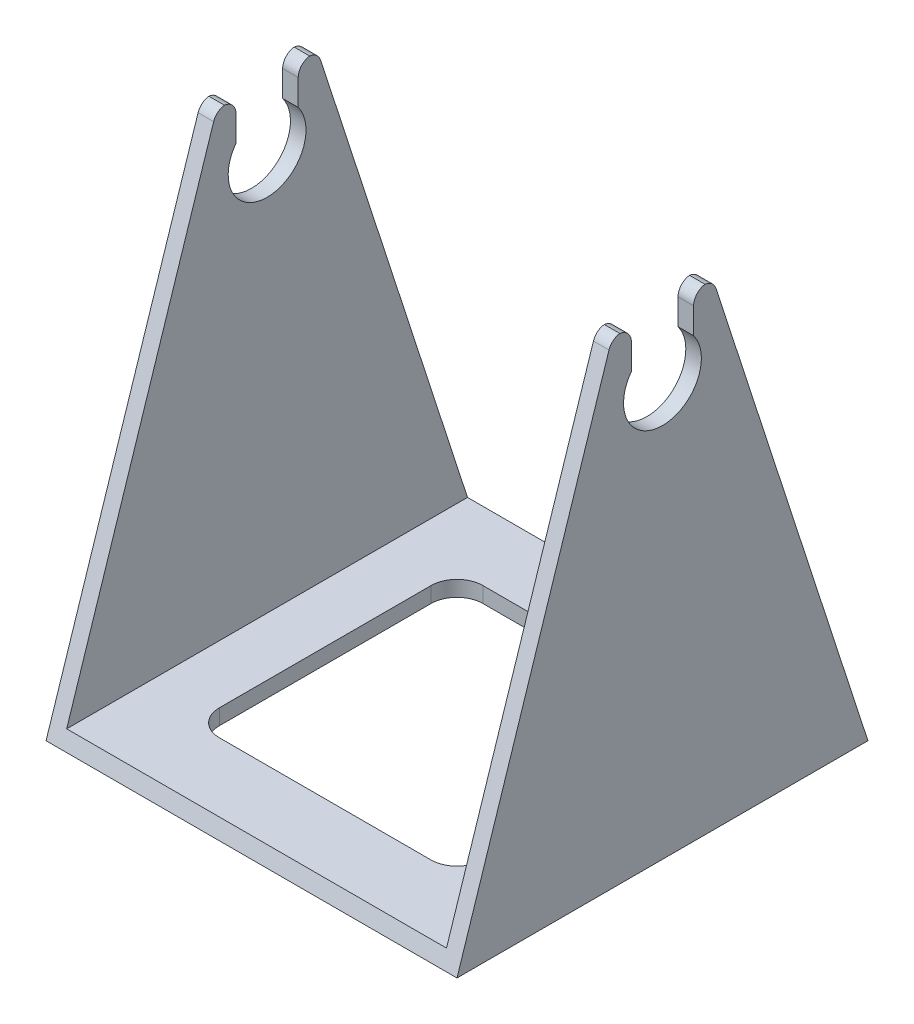
ISO-10303-21;
HEADER;
FILE_DESCRIPTION(('STEP AP214'),'2;1');
FILE_NAME('part.step','',(''),(''),'','','');
FILE_SCHEMA(('AUTOMOTIVE_DESIGN { 1 0 10303 214 1 1 1 1 }'));
ENDSEC;
DATA;
#1=APPLICATION_CONTEXT('core data for automotive mechanical design processes');
#2=APPLICATION_PROTOCOL_DEFINITION('international standard','automotive_design',2000,#1);
#3=PRODUCT_CONTEXT('',#1,'mechanical');
#4=PRODUCT('Part','Part','',(#3));
#5=PRODUCT_RELATED_PRODUCT_CATEGORY('part','',(#4));
#6=PRODUCT_DEFINITION_FORMATION('','',#4);
#7=PRODUCT_DEFINITION_CONTEXT('part definition',#1,'design');
#8=PRODUCT_DEFINITION('design','',#6,#7);
#9=PRODUCT_DEFINITION_SHAPE('','',#8);
#10=(LENGTH_UNIT() NAMED_UNIT(*) SI_UNIT(.MILLI.,.METRE.));
#11=(NAMED_UNIT(*) PLANE_ANGLE_UNIT() SI_UNIT($,.RADIAN.));
#12=(NAMED_UNIT(*) SI_UNIT($,.STERADIAN.) SOLID_ANGLE_UNIT());
#13=UNCERTAINTY_MEASURE_WITH_UNIT(LENGTH_MEASURE(1.E-05),#10,'distance_accuracy_value','');
#14=(GEOMETRIC_REPRESENTATION_CONTEXT(3) GLOBAL_UNCERTAINTY_ASSIGNED_CONTEXT((#13)) GLOBAL_UNIT_ASSIGNED_CONTEXT((#10,
#11,#12)) REPRESENTATION_CONTEXT('',''));
#15=CARTESIAN_POINT('',(0.,0.,0.));
#16=DIRECTION('',(0.,0.,1.));
#17=DIRECTION('',(1.,0.,0.));
#18=AXIS2_PLACEMENT_3D('',#15,#16,#17);
#19=CARTESIAN_POINT('',(0.,3.,0.));
#20=DIRECTION('',(0.,1.,0.));
#21=DIRECTION('',(0.,0.,1.));
#22=AXIS2_PLACEMENT_3D('',#19,#20,#21);
#23=PLANE('',#22);
#24=DIRECTION('',(1.,0.,0.));
#25=VECTOR('',#24,1.);
#26=CARTESIAN_POINT('',(0.,3.,-38.6252409113013));
#27=LINE('',#26,#25);
#28=CARTESIAN_POINT('',(-36.6,3.,-38.6252409113013));
#29=VERTEX_POINT('',#28);
#30=CARTESIAN_POINT('',(36.6,3.,-38.6252409113013));
#31=VERTEX_POINT('',#30);
#32=EDGE_CURVE('E257',#29,#31,#27,.T.);
#33=ORIENTED_EDGE('',*,*,#32,.F.);
#34=DIRECTION('',(0.,0.,-1.));
#35=VECTOR('',#34,1.);
#36=CARTESIAN_POINT('',(-36.6,3.,-39.6));
#37=LINE('',#36,#35);
#38=CARTESIAN_POINT('',(-36.6,3.,38.6252409113013));
#39=VERTEX_POINT('',#38);
#40=EDGE_CURVE('E280',#39,#29,#37,.T.);
#41=ORIENTED_EDGE('',*,*,#40,.F.);
#42=DIRECTION('',(-1.,0.,0.));
#43=VECTOR('',#42,1.);
#44=CARTESIAN_POINT('',(0.,3.,38.6252409113013));
#45=LINE('',#44,#43);
#46=CARTESIAN_POINT('',(36.6,3.,38.6252409113013));
#47=VERTEX_POINT('',#46);
#48=EDGE_CURVE('E271',#47,#39,#45,.T.);
#49=ORIENTED_EDGE('',*,*,#48,.F.);
#50=DIRECTION('',(0.,0.,1.));
#51=VECTOR('',#50,1.);
#52=CARTESIAN_POINT('',(36.6,3.,-39.6));
#53=LINE('',#52,#51);
#54=EDGE_CURVE('E278',#31,#47,#53,.T.);
#55=ORIENTED_EDGE('',*,*,#54,.F.);
#56=EDGE_LOOP('',(#33,#41,#49,#55));
#57=FACE_BOUND('',#56,.T.);
#58=CARTESIAN_POINT('',(20.4,3.,20.4));
#59=DIRECTION('',(0.,1.,0.));
#60=DIRECTION('',(0.,0.,1.));
#61=AXIS2_PLACEMENT_3D('',#58,#59,#60);
#62=CIRCLE('',#61,5.);
#63=CARTESIAN_POINT('',(20.4,3.,25.4));
#64=VERTEX_POINT('',#63);
#65=CARTESIAN_POINT('',(25.4,3.,20.4));
#66=VERTEX_POINT('',#65);
#67=EDGE_CURVE('E283',#64,#66,#62,.T.);
#68=ORIENTED_EDGE('',*,*,#67,.F.);
#69=DIRECTION('',(1.,0.,0.));
#70=VECTOR('',#69,1.);
#71=CARTESIAN_POINT('',(-20.4,3.,25.4));
#72=LINE('',#71,#70);
#73=CARTESIAN_POINT('',(-20.4,3.,25.4));
#74=VERTEX_POINT('',#73);
#75=EDGE_CURVE('E288',#74,#64,#72,.T.);
#76=ORIENTED_EDGE('',*,*,#75,.F.);
#77=CARTESIAN_POINT('',(-20.4,3.,20.4));
#78=DIRECTION('',(0.,1.,0.));
#79=DIRECTION('',(0.,0.,-1.));
#80=AXIS2_PLACEMENT_3D('',#77,#78,#79);
#81=CIRCLE('',#80,5.);
#82=CARTESIAN_POINT('',(-25.4,3.,20.4));
#83=VERTEX_POINT('',#82);
#84=EDGE_CURVE('E326',#83,#74,#81,.T.);
#85=ORIENTED_EDGE('',*,*,#84,.F.);
#86=DIRECTION('',(0.,0.,1.));
#87=VECTOR('',#86,1.);
#88=CARTESIAN_POINT('',(-25.4,3.,20.4));
#89=LINE('',#88,#87);
#90=CARTESIAN_POINT('',(-25.4,3.,-20.4));
#91=VERTEX_POINT('',#90);
#92=EDGE_CURVE('E323',#91,#83,#89,.T.);
#93=ORIENTED_EDGE('',*,*,#92,.F.);
#94=CARTESIAN_POINT('',(-20.4,3.,-20.4));
#95=DIRECTION('',(0.,1.,0.));
#96=DIRECTION('',(0.,0.,-1.));
#97=AXIS2_PLACEMENT_3D('',#94,#95,#96);
#98=CIRCLE('',#97,5.);
#99=CARTESIAN_POINT('',(-20.4,3.,-25.4));
#100=VERTEX_POINT('',#99);
#101=EDGE_CURVE('E320',#100,#91,#98,.T.);
#102=ORIENTED_EDGE('',*,*,#101,.F.);
#103=DIRECTION('',(-1.,0.,0.));
#104=VECTOR('',#103,1.);
#105=CARTESIAN_POINT('',(-20.4,3.,-25.4));
#106=LINE('',#105,#104);
#107=CARTESIAN_POINT('',(20.4,3.,-25.4));
#108=VERTEX_POINT('',#107);
#109=EDGE_CURVE('E317',#108,#100,#106,.T.);
#110=ORIENTED_EDGE('',*,*,#109,.F.);
#111=CARTESIAN_POINT('',(20.4,3.,-20.4));
#112=DIRECTION('',(0.,1.,0.));
#113=DIRECTION('',(0.,0.,-1.));
#114=AXIS2_PLACEMENT_3D('',#111,#112,#113);
#115=CIRCLE('',#114,5.);
#116=CARTESIAN_POINT('',(25.4,3.,-20.4));
#117=VERTEX_POINT('',#116);
#118=EDGE_CURVE('E314',#117,#108,#115,.T.);
#119=ORIENTED_EDGE('',*,*,#118,.F.);
#120=DIRECTION('',(0.,0.,-1.));
#121=VECTOR('',#120,1.);
#122=CARTESIAN_POINT('',(25.4,3.,20.4));
#123=LINE('',#122,#121);
#124=EDGE_CURVE('E311',#66,#117,#123,.T.);
#125=ORIENTED_EDGE('',*,*,#124,.F.);
#126=EDGE_LOOP('',(#68,#76,#85,#93,#102,#110,#119,#125));
#127=FACE_BOUND('',#126,.T.);
#128=ADVANCED_FACE('F35',(#57,#127),#23,.T.);
#129=CARTESIAN_POINT('',(39.6,3.,-39.6));
#130=DIRECTION('',(-1.,0.,0.));
#131=DIRECTION('',(0.,0.,1.));
#132=AXIS2_PLACEMENT_3D('',#129,#130,#131);
#133=PLANE('',#132);
#134=DIRECTION('',(0.,1.,0.));
#135=VECTOR('',#134,1.);
#136=CARTESIAN_POINT('',(39.6,3.00000000000001,6.));
#137=LINE('',#136,#135);
#138=CARTESIAN_POINT('',(39.6,84.4,5.99999999999999));
#139=VERTEX_POINT('',#138);
#140=CARTESIAN_POINT('',(39.6,89.4,5.99999999999999));
#141=VERTEX_POINT('',#140);
#142=EDGE_CURVE('E452',#139,#141,#137,.T.);
#143=ORIENTED_EDGE('',*,*,#142,.T.);
#144=CARTESIAN_POINT('',(39.6,89.4,8.49999999999999));
#145=DIRECTION('',(-1.,0.,0.));
#146=DIRECTION('',(0.,0.,1.));
#147=AXIS2_PLACEMENT_3D('',#144,#145,#146);
#148=CIRCLE('',#147,2.5);
#149=CARTESIAN_POINT('',(39.6,91.8833281577271,8.21176179809139));
#150=VERTEX_POINT('',#149);
#151=EDGE_CURVE('E378',#141,#150,#148,.F.);
#152=ORIENTED_EDGE('',*,*,#151,.T.);
#153=CARTESIAN_POINT('',(39.6,89.4,7.92352359618279));
#154=DIRECTION('',(-1.,0.,0.));
#155=DIRECTION('',(0.,0.,1.));
#156=AXIS2_PLACEMENT_3D('',#153,#154,#155);
#157=CIRCLE('',#156,2.5);
#158=CARTESIAN_POINT('',(39.6,90.1725424859374,10.3011648869207));
#159=VERTEX_POINT('',#158);
#160=EDGE_CURVE('E376',#150,#159,#157,.F.);
#161=ORIENTED_EDGE('',*,*,#160,.T.);
#162=DIRECTION('',(0.,0.951056516295155,-0.309016994374945));
#163=VECTOR('',#162,1.);
#164=CARTESIAN_POINT('',(39.6,0.,39.6));
#165=LINE('',#164,#163);
#166=CARTESIAN_POINT('',(39.6,0.,39.6));
#167=VERTEX_POINT('',#166);
#168=EDGE_CURVE('E265',#167,#159,#165,.T.);
#169=ORIENTED_EDGE('',*,*,#168,.F.);
#170=DIRECTION('',(0.,0.,-1.));
#171=VECTOR('',#170,1.);
#172=CARTESIAN_POINT('',(39.6,0.,-39.6));
#173=LINE('',#172,#171);
#174=CARTESIAN_POINT('',(39.6,0.,-39.6));
#175=VERTEX_POINT('',#174);
#176=EDGE_CURVE('E333',#167,#175,#173,.T.);
#177=ORIENTED_EDGE('',*,*,#176,.T.);
#178=DIRECTION('',(0.,-0.951056516295152,-0.309016994374952));
#179=VECTOR('',#178,1.);
#180=CARTESIAN_POINT('',(39.6,0.,-39.6));
#181=LINE('',#180,#179);
#182=CARTESIAN_POINT('',(39.6,90.1725424859374,-10.3011648869199));
#183=VERTEX_POINT('',#182);
#184=EDGE_CURVE('E247',#183,#175,#181,.T.);
#185=ORIENTED_EDGE('',*,*,#184,.F.);
#186=CARTESIAN_POINT('',(39.6,89.4,-7.92352359618207));
#187=DIRECTION('',(-1.,0.,0.));
#188=DIRECTION('',(0.,0.,1.));
#189=AXIS2_PLACEMENT_3D('',#186,#187,#188);
#190=CIRCLE('',#189,2.5);
#191=CARTESIAN_POINT('',(39.6,91.8833281577271,-8.21176179809104));
#192=VERTEX_POINT('',#191);
#193=EDGE_CURVE('E372',#183,#192,#190,.F.);
#194=ORIENTED_EDGE('',*,*,#193,.T.);
#195=CARTESIAN_POINT('',(39.6,89.4,-8.50000000000001));
#196=DIRECTION('',(-1.,0.,0.));
#197=DIRECTION('',(0.,0.,1.));
#198=AXIS2_PLACEMENT_3D('',#195,#196,#197);
#199=CIRCLE('',#198,2.5);
#200=CARTESIAN_POINT('',(39.6,89.4,-6.00000000000001));
#201=VERTEX_POINT('',#200);
#202=EDGE_CURVE('E374',#192,#201,#199,.F.);
#203=ORIENTED_EDGE('',*,*,#202,.T.);
#204=DIRECTION('',(0.,-1.,0.));
#205=VECTOR('',#204,1.);
#206=CARTESIAN_POINT('',(39.6,3.,-6.));
#207=LINE('',#206,#205);
#208=CARTESIAN_POINT('',(39.6,84.4,-6.00000000000001));
#209=VERTEX_POINT('',#208);
#210=EDGE_CURVE('E442',#201,#209,#207,.T.);
#211=ORIENTED_EDGE('',*,*,#210,.T.);
#212=CARTESIAN_POINT('',(39.6,79.9,0.));
#213=DIRECTION('',(1.,0.,0.));
#214=DIRECTION('',(0.,0.,-1.));
#215=AXIS2_PLACEMENT_3D('',#212,#213,#214);
#216=CIRCLE('',#215,7.50000000000001);
#217=EDGE_CURVE('E360',#139,#209,#216,.T.);
#218=ORIENTED_EDGE('',*,*,#217,.F.);
#219=EDGE_LOOP('',(#143,#152,#161,#169,#177,#185,#194,#203,#211,#218));
#220=FACE_BOUND('',#219,.T.);
#221=ADVANCED_FACE('F464',(#220),#133,.F.);
#222=CARTESIAN_POINT('',(-39.6,3.,-39.6));
#223=DIRECTION('',(1.,0.,0.));
#224=DIRECTION('',(0.,0.,-1.));
#225=AXIS2_PLACEMENT_3D('',#222,#223,#224);
#226=PLANE('',#225);
#227=DIRECTION('',(0.,-1.,0.));
#228=VECTOR('',#227,1.);
#229=CARTESIAN_POINT('',(-39.6,94.9,-6.00000000000001));
#230=LINE('',#229,#228);
#231=CARTESIAN_POINT('',(-39.6,89.4,-6.00000000000001));
#232=VERTEX_POINT('',#231);
#233=CARTESIAN_POINT('',(-39.6,84.4,-6.00000000000001));
#234=VERTEX_POINT('',#233);
#235=EDGE_CURVE('E241',#232,#234,#230,.T.);
#236=ORIENTED_EDGE('',*,*,#235,.F.);
#237=CARTESIAN_POINT('',(-39.6,89.4,-8.50000000000001));
#238=DIRECTION('',(1.,0.,0.));
#239=DIRECTION('',(0.,0.,-1.));
#240=AXIS2_PLACEMENT_3D('',#237,#238,#239);
#241=CIRCLE('',#240,2.5);
#242=CARTESIAN_POINT('',(-39.6,91.8833281577271,-8.21176179809104));
#243=VERTEX_POINT('',#242);
#244=EDGE_CURVE('E44',#232,#243,#241,.F.);
#245=ORIENTED_EDGE('',*,*,#244,.T.);
#246=CARTESIAN_POINT('',(-39.6,89.4,-7.92352359618206));
#247=DIRECTION('',(1.,0.,0.));
#248=DIRECTION('',(0.,0.,-1.));
#249=AXIS2_PLACEMENT_3D('',#246,#247,#248);
#250=CIRCLE('',#249,2.5);
#251=CARTESIAN_POINT('',(-39.6,90.1725424859374,-10.3011648869199));
#252=VERTEX_POINT('',#251);
#253=EDGE_CURVE('E403',#243,#252,#250,.F.);
#254=ORIENTED_EDGE('',*,*,#253,.T.);
#255=DIRECTION('',(0.,-0.951056516295152,-0.309016994374952));
#256=VECTOR('',#255,1.);
#257=CARTESIAN_POINT('',(-39.6,2.71352549156241,-38.7183221215613));
#258=LINE('',#257,#256);
#259=CARTESIAN_POINT('',(-39.6,0.,-39.6));
#260=VERTEX_POINT('',#259);
#261=EDGE_CURVE('E263',#252,#260,#258,.T.);
#262=ORIENTED_EDGE('',*,*,#261,.T.);
#263=DIRECTION('',(0.,0.,1.));
#264=VECTOR('',#263,1.);
#265=CARTESIAN_POINT('',(-39.6,0.,-39.6));
#266=LINE('',#265,#264);
#267=CARTESIAN_POINT('',(-39.6,0.,39.6));
#268=VERTEX_POINT('',#267);
#269=EDGE_CURVE('E353',#260,#268,#266,.T.);
#270=ORIENTED_EDGE('',*,*,#269,.T.);
#271=DIRECTION('',(0.,0.951056516295155,-0.309016994374945));
#272=VECTOR('',#271,1.);
#273=CARTESIAN_POINT('',(-39.6,25.9898214823442,31.1553950988093));
#274=LINE('',#273,#272);
#275=CARTESIAN_POINT('',(-39.6,90.1725424859374,10.3011648869207));
#276=VERTEX_POINT('',#275);
#277=EDGE_CURVE('E276',#268,#276,#274,.T.);
#278=ORIENTED_EDGE('',*,*,#277,.T.);
#279=CARTESIAN_POINT('',(-39.6,89.4,7.92352359618279));
#280=DIRECTION('',(1.,0.,0.));
#281=DIRECTION('',(0.,0.,-1.));
#282=AXIS2_PLACEMENT_3D('',#279,#280,#281);
#283=CIRCLE('',#282,2.5);
#284=CARTESIAN_POINT('',(-39.6,91.8833281577271,8.21176179809139));
#285=VERTEX_POINT('',#284);
#286=EDGE_CURVE('E58',#276,#285,#283,.F.);
#287=ORIENTED_EDGE('',*,*,#286,.T.);
#288=CARTESIAN_POINT('',(-39.6,89.4,8.49999999999999));
#289=DIRECTION('',(1.,0.,0.));
#290=DIRECTION('',(0.,0.,-1.));
#291=AXIS2_PLACEMENT_3D('',#288,#289,#290);
#292=CIRCLE('',#291,2.5);
#293=CARTESIAN_POINT('',(-39.6,89.4,5.99999999999999));
#294=VERTEX_POINT('',#293);
#295=EDGE_CURVE('E240',#285,#294,#292,.F.);
#296=ORIENTED_EDGE('',*,*,#295,.T.);
#297=DIRECTION('',(0.,1.,0.));
#298=VECTOR('',#297,1.);
#299=CARTESIAN_POINT('',(-39.6,94.9,5.99999999999999));
#300=LINE('',#299,#298);
#301=CARTESIAN_POINT('',(-39.6,84.4,5.99999999999999));
#302=VERTEX_POINT('',#301);
#303=EDGE_CURVE('E225',#302,#294,#300,.T.);
#304=ORIENTED_EDGE('',*,*,#303,.F.);
#305=CARTESIAN_POINT('',(-39.6,79.9,0.));
#306=DIRECTION('',(1.,0.,0.));
#307=DIRECTION('',(0.,0.,-1.));
#308=AXIS2_PLACEMENT_3D('',#305,#306,#307);
#309=CIRCLE('',#308,7.50000000000001);
#310=EDGE_CURVE('E238',#302,#234,#309,.T.);
#311=ORIENTED_EDGE('',*,*,#310,.T.);
#312=EDGE_LOOP('',(#236,#245,#254,#262,#270,#278,#287,#296,#304,#311));
#313=FACE_BOUND('',#312,.T.);
#314=ADVANCED_FACE('F237',(#313),#226,.F.);
#315=CARTESIAN_POINT('',(0.,0.,0.));
#316=DIRECTION('',(0.,1.,0.));
#317=DIRECTION('',(0.,0.,1.));
#318=AXIS2_PLACEMENT_3D('',#315,#316,#317);
#319=PLANE('',#318);
#320=DIRECTION('',(1.,0.,0.));
#321=VECTOR('',#320,1.);
#322=CARTESIAN_POINT('',(-20.4,0.,25.4));
#323=LINE('',#322,#321);
#324=CARTESIAN_POINT('',(-20.4,0.,25.4));
#325=VERTEX_POINT('',#324);
#326=CARTESIAN_POINT('',(20.4,0.,25.4));
#327=VERTEX_POINT('',#326);
#328=EDGE_CURVE('E306',#325,#327,#323,.T.);
#329=ORIENTED_EDGE('',*,*,#328,.T.);
#330=CARTESIAN_POINT('',(20.4,0.,20.4));
#331=DIRECTION('',(0.,1.,0.));
#332=DIRECTION('',(0.,0.,1.));
#333=AXIS2_PLACEMENT_3D('',#330,#331,#332);
#334=CIRCLE('',#333,5.);
#335=CARTESIAN_POINT('',(25.4,0.,20.4));
#336=VERTEX_POINT('',#335);
#337=EDGE_CURVE('E284',#327,#336,#334,.T.);
#338=ORIENTED_EDGE('',*,*,#337,.T.);
#339=DIRECTION('',(0.,0.,-1.));
#340=VECTOR('',#339,1.);
#341=CARTESIAN_POINT('',(25.4,0.,20.4));
#342=LINE('',#341,#340);
#343=CARTESIAN_POINT('',(25.4,0.,-20.4));
#344=VERTEX_POINT('',#343);
#345=EDGE_CURVE('E287',#336,#344,#342,.T.);
#346=ORIENTED_EDGE('',*,*,#345,.T.);
#347=CARTESIAN_POINT('',(20.4,0.,-20.4));
#348=DIRECTION('',(0.,1.,0.));
#349=DIRECTION('',(0.,0.,-1.));
#350=AXIS2_PLACEMENT_3D('',#347,#348,#349);
#351=CIRCLE('',#350,5.);
#352=CARTESIAN_POINT('',(20.4,0.,-25.4));
#353=VERTEX_POINT('',#352);
#354=EDGE_CURVE('E291',#344,#353,#351,.T.);
#355=ORIENTED_EDGE('',*,*,#354,.T.);
#356=DIRECTION('',(-1.,0.,0.));
#357=VECTOR('',#356,1.);
#358=CARTESIAN_POINT('',(-20.4,0.,-25.4));
#359=LINE('',#358,#357);
#360=CARTESIAN_POINT('',(-20.4,0.,-25.4));
#361=VERTEX_POINT('',#360);
#362=EDGE_CURVE('E294',#353,#361,#359,.T.);
#363=ORIENTED_EDGE('',*,*,#362,.T.);
#364=CARTESIAN_POINT('',(-20.4,0.,-20.4));
#365=DIRECTION('',(0.,1.,0.));
#366=DIRECTION('',(0.,0.,-1.));
#367=AXIS2_PLACEMENT_3D('',#364,#365,#366);
#368=CIRCLE('',#367,5.);
#369=CARTESIAN_POINT('',(-25.4,0.,-20.4));
#370=VERTEX_POINT('',#369);
#371=EDGE_CURVE('E297',#361,#370,#368,.T.);
#372=ORIENTED_EDGE('',*,*,#371,.T.);
#373=DIRECTION('',(0.,0.,1.));
#374=VECTOR('',#373,1.);
#375=CARTESIAN_POINT('',(-25.4,0.,20.4));
#376=LINE('',#375,#374);
#377=CARTESIAN_POINT('',(-25.4,0.,20.4));
#378=VERTEX_POINT('',#377);
#379=EDGE_CURVE('E300',#370,#378,#376,.T.);
#380=ORIENTED_EDGE('',*,*,#379,.T.);
#381=CARTESIAN_POINT('',(-20.4,0.,20.4));
#382=DIRECTION('',(0.,1.,0.));
#383=DIRECTION('',(0.,0.,-1.));
#384=AXIS2_PLACEMENT_3D('',#381,#382,#383);
#385=CIRCLE('',#384,5.);
#386=EDGE_CURVE('E303',#378,#325,#385,.T.);
#387=ORIENTED_EDGE('',*,*,#386,.T.);
#388=EDGE_LOOP('',(#329,#338,#346,#355,#363,#372,#380,#387));
#389=FACE_BOUND('',#388,.T.);
#390=ORIENTED_EDGE('',*,*,#176,.F.);
#391=DIRECTION('',(1.,0.,0.));
#392=VECTOR('',#391,1.);
#393=CARTESIAN_POINT('',(-39.6,0.,39.6));
#394=LINE('',#393,#392);
#395=EDGE_CURVE('E356',#268,#167,#394,.T.);
#396=ORIENTED_EDGE('',*,*,#395,.F.);
#397=ORIENTED_EDGE('',*,*,#269,.F.);
#398=DIRECTION('',(-1.,0.,0.));
#399=VECTOR('',#398,1.);
#400=CARTESIAN_POINT('',(-39.6,0.,-39.6));
#401=LINE('',#400,#399);
#402=EDGE_CURVE('E350',#175,#260,#401,.T.);
#403=ORIENTED_EDGE('',*,*,#402,.F.);
#404=EDGE_LOOP('',(#390,#396,#397,#403));
#405=FACE_BOUND('',#404,.T.);
#406=ADVANCED_FACE('F432',(#389,#405),#319,.F.);
#407=CARTESIAN_POINT('',(20.4,0.,20.4));
#408=DIRECTION('',(0.,1.,0.));
#409=DIRECTION('',(0.,0.,1.));
#410=AXIS2_PLACEMENT_3D('',#407,#408,#409);
#411=CYLINDRICAL_SURFACE('',#410,5.);
#412=ORIENTED_EDGE('',*,*,#67,.T.);
#413=DIRECTION('',(0.,1.,0.));
#414=VECTOR('',#413,1.);
#415=CARTESIAN_POINT('',(25.4,0.,20.4));
#416=LINE('',#415,#414);
#417=EDGE_CURVE('E309',#336,#66,#416,.T.);
#418=ORIENTED_EDGE('',*,*,#417,.F.);
#419=ORIENTED_EDGE('',*,*,#337,.F.);
#420=DIRECTION('',(0.,1.,0.));
#421=VECTOR('',#420,1.);
#422=CARTESIAN_POINT('',(20.4,0.,25.4));
#423=LINE('',#422,#421);
#424=EDGE_CURVE('E331',#327,#64,#423,.T.);
#425=ORIENTED_EDGE('',*,*,#424,.T.);
#426=EDGE_LOOP('',(#412,#418,#419,#425));
#427=FACE_BOUND('',#426,.T.);
#428=ADVANCED_FACE('F528',(#427),#411,.F.);
#429=CARTESIAN_POINT('',(-20.4,0.,25.4));
#430=DIRECTION('',(0.,0.,1.));
#431=DIRECTION('',(1.,0.,0.));
#432=AXIS2_PLACEMENT_3D('',#429,#430,#431);
#433=PLANE('',#432);
#434=ORIENTED_EDGE('',*,*,#75,.T.);
#435=ORIENTED_EDGE('',*,*,#424,.F.);
#436=ORIENTED_EDGE('',*,*,#328,.F.);
#437=DIRECTION('',(0.,1.,0.));
#438=VECTOR('',#437,1.);
#439=CARTESIAN_POINT('',(-20.4,0.,25.4));
#440=LINE('',#439,#438);
#441=EDGE_CURVE('E334',#325,#74,#440,.T.);
#442=ORIENTED_EDGE('',*,*,#441,.T.);
#443=EDGE_LOOP('',(#434,#435,#436,#442));
#444=FACE_BOUND('',#443,.T.);
#445=ADVANCED_FACE('F566',(#444),#433,.F.);
#446=CARTESIAN_POINT('',(-20.4,0.,20.4));
#447=DIRECTION('',(0.,1.,0.));
#448=DIRECTION('',(0.,0.,1.));
#449=AXIS2_PLACEMENT_3D('',#446,#447,#448);
#450=CYLINDRICAL_SURFACE('',#449,5.);
#451=ORIENTED_EDGE('',*,*,#84,.T.);
#452=ORIENTED_EDGE('',*,*,#441,.F.);
#453=ORIENTED_EDGE('',*,*,#386,.F.);
#454=DIRECTION('',(0.,1.,0.));
#455=VECTOR('',#454,1.);
#456=CARTESIAN_POINT('',(-25.4,0.,20.4));
#457=LINE('',#456,#455);
#458=EDGE_CURVE('E336',#378,#83,#457,.T.);
#459=ORIENTED_EDGE('',*,*,#458,.T.);
#460=EDGE_LOOP('',(#451,#452,#453,#459));
#461=FACE_BOUND('',#460,.T.);
#462=ADVANCED_FACE('F569',(#461),#450,.F.);
#463=CARTESIAN_POINT('',(-25.4,0.,20.4));
#464=DIRECTION('',(-1.,0.,0.));
#465=DIRECTION('',(0.,0.,1.));
#466=AXIS2_PLACEMENT_3D('',#463,#464,#465);
#467=PLANE('',#466);
#468=ORIENTED_EDGE('',*,*,#92,.T.);
#469=ORIENTED_EDGE('',*,*,#458,.F.);
#470=ORIENTED_EDGE('',*,*,#379,.F.);
#471=DIRECTION('',(0.,1.,0.));
#472=VECTOR('',#471,1.);
#473=CARTESIAN_POINT('',(-25.4,0.,-20.4));
#474=LINE('',#473,#472);
#475=EDGE_CURVE('E338',#370,#91,#474,.T.);
#476=ORIENTED_EDGE('',*,*,#475,.T.);
#477=EDGE_LOOP('',(#468,#469,#470,#476));
#478=FACE_BOUND('',#477,.T.);
#479=ADVANCED_FACE('F573',(#478),#467,.F.);
#480=CARTESIAN_POINT('',(-20.4,0.,-20.4));
#481=DIRECTION('',(0.,1.,0.));
#482=DIRECTION('',(0.,0.,1.));
#483=AXIS2_PLACEMENT_3D('',#480,#481,#482);
#484=CYLINDRICAL_SURFACE('',#483,5.);
#485=ORIENTED_EDGE('',*,*,#101,.T.);
#486=ORIENTED_EDGE('',*,*,#475,.F.);
#487=ORIENTED_EDGE('',*,*,#371,.F.);
#488=DIRECTION('',(0.,1.,0.));
#489=VECTOR('',#488,1.);
#490=CARTESIAN_POINT('',(-20.4,0.,-25.4));
#491=LINE('',#490,#489);
#492=EDGE_CURVE('E340',#361,#100,#491,.T.);
#493=ORIENTED_EDGE('',*,*,#492,.T.);
#494=EDGE_LOOP('',(#485,#486,#487,#493));
#495=FACE_BOUND('',#494,.T.);
#496=ADVANCED_FACE('F577',(#495),#484,.F.);
#497=CARTESIAN_POINT('',(-20.4,0.,-25.4));
#498=DIRECTION('',(0.,0.,-1.));
#499=DIRECTION('',(-1.,0.,0.));
#500=AXIS2_PLACEMENT_3D('',#497,#498,#499);
#501=PLANE('',#500);
#502=ORIENTED_EDGE('',*,*,#109,.T.);
#503=ORIENTED_EDGE('',*,*,#492,.F.);
#504=ORIENTED_EDGE('',*,*,#362,.F.);
#505=DIRECTION('',(0.,1.,0.));
#506=VECTOR('',#505,1.);
#507=CARTESIAN_POINT('',(20.4,0.,-25.4));
#508=LINE('',#507,#506);
#509=EDGE_CURVE('E342',#353,#108,#508,.T.);
#510=ORIENTED_EDGE('',*,*,#509,.T.);
#511=EDGE_LOOP('',(#502,#503,#504,#510));
#512=FACE_BOUND('',#511,.T.);
#513=ADVANCED_FACE('F581',(#512),#501,.F.);
#514=CARTESIAN_POINT('',(20.4,0.,-20.4));
#515=DIRECTION('',(0.,1.,0.));
#516=DIRECTION('',(0.,0.,1.));
#517=AXIS2_PLACEMENT_3D('',#514,#515,#516);
#518=CYLINDRICAL_SURFACE('',#517,5.);
#519=ORIENTED_EDGE('',*,*,#118,.T.);
#520=ORIENTED_EDGE('',*,*,#509,.F.);
#521=ORIENTED_EDGE('',*,*,#354,.F.);
#522=DIRECTION('',(0.,1.,0.));
#523=VECTOR('',#522,1.);
#524=CARTESIAN_POINT('',(25.4,0.,-20.4));
#525=LINE('',#524,#523);
#526=EDGE_CURVE('E344',#344,#117,#525,.T.);
#527=ORIENTED_EDGE('',*,*,#526,.T.);
#528=EDGE_LOOP('',(#519,#520,#521,#527));
#529=FACE_BOUND('',#528,.T.);
#530=ADVANCED_FACE('F585',(#529),#518,.F.);
#531=CARTESIAN_POINT('',(25.4,0.,20.4));
#532=DIRECTION('',(1.,0.,0.));
#533=DIRECTION('',(0.,0.,-1.));
#534=AXIS2_PLACEMENT_3D('',#531,#532,#533);
#535=PLANE('',#534);
#536=ORIENTED_EDGE('',*,*,#124,.T.);
#537=ORIENTED_EDGE('',*,*,#526,.F.);
#538=ORIENTED_EDGE('',*,*,#345,.F.);
#539=ORIENTED_EDGE('',*,*,#417,.T.);
#540=EDGE_LOOP('',(#536,#537,#538,#539));
#541=FACE_BOUND('',#540,.T.);
#542=ADVANCED_FACE('F565',(#541),#535,.F.);
#543=CARTESIAN_POINT('',(-36.6,91.9,-39.6));
#544=DIRECTION('',(-1.,0.,0.));
#545=DIRECTION('',(0.,0.,1.));
#546=AXIS2_PLACEMENT_3D('',#543,#544,#545);
#547=PLANE('',#546);
#548=CARTESIAN_POINT('',(-36.6,89.4,-7.92352359618206));
#549=DIRECTION('',(-1.,0.,0.));
#550=DIRECTION('',(0.,0.,1.));
#551=AXIS2_PLACEMENT_3D('',#548,#549,#550);
#552=CIRCLE('',#551,2.5);
#553=CARTESIAN_POINT('',(-36.6,90.1725424859374,-10.3011648869199));
#554=VERTEX_POINT('',#553);
#555=CARTESIAN_POINT('',(-36.6,91.8833281577271,-8.21176179809104));
#556=VERTEX_POINT('',#555);
#557=EDGE_CURVE('E397',#554,#556,#552,.F.);
#558=ORIENTED_EDGE('',*,*,#557,.T.);
#559=CARTESIAN_POINT('',(-36.6,89.4,-8.50000000000001));
#560=DIRECTION('',(-1.,0.,0.));
#561=DIRECTION('',(0.,0.,1.));
#562=AXIS2_PLACEMENT_3D('',#559,#560,#561);
#563=CIRCLE('',#562,2.5);
#564=CARTESIAN_POINT('',(-36.6,89.4,-6.00000000000001));
#565=VERTEX_POINT('',#564);
#566=EDGE_CURVE('E399',#556,#565,#563,.F.);
#567=ORIENTED_EDGE('',*,*,#566,.T.);
#568=DIRECTION('',(0.,-1.,0.));
#569=VECTOR('',#568,1.);
#570=CARTESIAN_POINT('',(-36.6,91.9,-6.00000000000001));
#571=LINE('',#570,#569);
#572=CARTESIAN_POINT('',(-36.6,84.4,-6.00000000000001));
#573=VERTEX_POINT('',#572);
#574=EDGE_CURVE('E471',#565,#573,#571,.T.);
#575=ORIENTED_EDGE('',*,*,#574,.T.);
#576=CARTESIAN_POINT('',(-36.6,79.9,0.));
#577=DIRECTION('',(-1.,0.,0.));
#578=DIRECTION('',(0.,0.,1.));
#579=AXIS2_PLACEMENT_3D('',#576,#577,#578);
#580=CIRCLE('',#579,7.50000000000001);
#581=CARTESIAN_POINT('',(-36.6,84.4,5.99999999999999));
#582=VERTEX_POINT('',#581);
#583=EDGE_CURVE('E248',#573,#582,#580,.T.);
#584=ORIENTED_EDGE('',*,*,#583,.T.);
#585=DIRECTION('',(0.,1.,0.));
#586=VECTOR('',#585,1.);
#587=CARTESIAN_POINT('',(-36.6,91.9,5.99999999999999));
#588=LINE('',#587,#586);
#589=CARTESIAN_POINT('',(-36.6,89.4,5.99999999999999));
#590=VERTEX_POINT('',#589);
#591=EDGE_CURVE('E228',#582,#590,#588,.T.);
#592=ORIENTED_EDGE('',*,*,#591,.T.);
#593=CARTESIAN_POINT('',(-36.6,89.4,8.49999999999999));
#594=DIRECTION('',(-1.,0.,0.));
#595=DIRECTION('',(0.,0.,1.));
#596=AXIS2_PLACEMENT_3D('',#593,#594,#595);
#597=CIRCLE('',#596,2.5);
#598=CARTESIAN_POINT('',(-36.6,91.8833281577271,8.21176179809139));
#599=VERTEX_POINT('',#598);
#600=EDGE_CURVE('E395',#590,#599,#597,.F.);
#601=ORIENTED_EDGE('',*,*,#600,.T.);
#602=CARTESIAN_POINT('',(-36.6,89.4,7.92352359618279));
#603=DIRECTION('',(-1.,0.,0.));
#604=DIRECTION('',(0.,0.,1.));
#605=AXIS2_PLACEMENT_3D('',#602,#603,#604);
#606=CIRCLE('',#605,2.5);
#607=CARTESIAN_POINT('',(-36.6,90.1725424859373,10.3011648869207));
#608=VERTEX_POINT('',#607);
#609=EDGE_CURVE('E393',#599,#608,#606,.F.);
#610=ORIENTED_EDGE('',*,*,#609,.T.);
#611=DIRECTION('',(0.,-0.951056516295155,0.309016994374945));
#612=VECTOR('',#611,1.);
#613=CARTESIAN_POINT('',(-36.6,106.400626882311,5.02834063440911));
#614=LINE('',#613,#612);
#615=EDGE_CURVE('E274',#608,#39,#614,.T.);
#616=ORIENTED_EDGE('',*,*,#615,.T.);
#617=ORIENTED_EDGE('',*,*,#40,.T.);
#618=DIRECTION('',(0.,0.951056516295152,0.309016994374952));
#619=VECTOR('',#618,1.);
#620=CARTESIAN_POINT('',(-36.6,83.1243308915286,-12.5912676571605));
#621=LINE('',#620,#619);
#622=EDGE_CURVE('E260',#29,#554,#621,.T.);
#623=ORIENTED_EDGE('',*,*,#622,.T.);
#624=EDGE_LOOP('',(#558,#567,#575,#584,#592,#601,#610,#616,#617,#623));
#625=FACE_BOUND('',#624,.T.);
#626=ADVANCED_FACE('F440',(#625),#547,.F.);
#627=CARTESIAN_POINT('',(36.6,91.9,-39.6));
#628=DIRECTION('',(1.,0.,0.));
#629=DIRECTION('',(0.,0.,-1.));
#630=AXIS2_PLACEMENT_3D('',#627,#628,#629);
#631=PLANE('',#630);
#632=CARTESIAN_POINT('',(36.6,89.4,7.92352359618279));
#633=DIRECTION('',(1.,0.,0.));
#634=DIRECTION('',(0.,0.,-1.));
#635=AXIS2_PLACEMENT_3D('',#632,#633,#634);
#636=CIRCLE('',#635,2.5);
#637=CARTESIAN_POINT('',(36.6,90.1725424859373,10.3011648869207));
#638=VERTEX_POINT('',#637);
#639=CARTESIAN_POINT('',(36.6,91.8833281577271,8.21176179809139));
#640=VERTEX_POINT('',#639);
#641=EDGE_CURVE('E365',#638,#640,#636,.F.);
#642=ORIENTED_EDGE('',*,*,#641,.T.);
#643=CARTESIAN_POINT('',(36.6,89.4,8.49999999999999));
#644=DIRECTION('',(1.,0.,0.));
#645=DIRECTION('',(0.,0.,-1.));
#646=AXIS2_PLACEMENT_3D('',#643,#644,#645);
#647=CIRCLE('',#646,2.5);
#648=CARTESIAN_POINT('',(36.6,89.4,5.99999999999998));
#649=VERTEX_POINT('',#648);
#650=EDGE_CURVE('E367',#640,#649,#647,.F.);
#651=ORIENTED_EDGE('',*,*,#650,.T.);
#652=DIRECTION('',(0.,-1.,0.));
#653=VECTOR('',#652,1.);
#654=CARTESIAN_POINT('',(36.6,91.9,5.99999999999998));
#655=LINE('',#654,#653);
#656=CARTESIAN_POINT('',(36.6,84.4,5.99999999999999));
#657=VERTEX_POINT('',#656);
#658=EDGE_CURVE('E445',#649,#657,#655,.T.);
#659=ORIENTED_EDGE('',*,*,#658,.T.);
#660=CARTESIAN_POINT('',(36.6,79.9,0.));
#661=DIRECTION('',(1.,0.,0.));
#662=DIRECTION('',(0.,0.,-1.));
#663=AXIS2_PLACEMENT_3D('',#660,#661,#662);
#664=CIRCLE('',#663,7.50000000000001);
#665=CARTESIAN_POINT('',(36.6,84.4,-6.));
#666=VERTEX_POINT('',#665);
#667=EDGE_CURVE('E252',#657,#666,#664,.T.);
#668=ORIENTED_EDGE('',*,*,#667,.T.);
#669=DIRECTION('',(0.,1.,0.));
#670=VECTOR('',#669,1.);
#671=CARTESIAN_POINT('',(36.6,91.9,-6.00000000000001));
#672=LINE('',#671,#670);
#673=CARTESIAN_POINT('',(36.6,89.4,-6.00000000000001));
#674=VERTEX_POINT('',#673);
#675=EDGE_CURVE('E447',#666,#674,#672,.T.);
#676=ORIENTED_EDGE('',*,*,#675,.T.);
#677=CARTESIAN_POINT('',(36.6,89.4,-8.50000000000001));
#678=DIRECTION('',(1.,0.,0.));
#679=DIRECTION('',(0.,0.,-1.));
#680=AXIS2_PLACEMENT_3D('',#677,#678,#679);
#681=CIRCLE('',#680,2.5);
#682=CARTESIAN_POINT('',(36.6,91.8833281577271,-8.21176179809104));
#683=VERTEX_POINT('',#682);
#684=EDGE_CURVE('E363',#674,#683,#681,.F.);
#685=ORIENTED_EDGE('',*,*,#684,.T.);
#686=CARTESIAN_POINT('',(36.6,89.4,-7.92352359618207));
#687=DIRECTION('',(1.,0.,0.));
#688=DIRECTION('',(0.,0.,-1.));
#689=AXIS2_PLACEMENT_3D('',#686,#687,#688);
#690=CIRCLE('',#689,2.5);
#691=CARTESIAN_POINT('',(36.6,90.1725424859374,-10.3011648869199));
#692=VERTEX_POINT('',#691);
#693=EDGE_CURVE('E233',#683,#692,#690,.F.);
#694=ORIENTED_EDGE('',*,*,#693,.T.);
#695=DIRECTION('',(0.,-0.951056516295152,-0.309016994374952));
#696=VECTOR('',#695,1.);
#697=CARTESIAN_POINT('',(36.6,83.1243308915286,-12.5912676571605));
#698=LINE('',#697,#696);
#699=EDGE_CURVE('E250',#692,#31,#698,.T.);
#700=ORIENTED_EDGE('',*,*,#699,.T.);
#701=ORIENTED_EDGE('',*,*,#54,.T.);
#702=DIRECTION('',(0.,0.951056516295155,-0.309016994374945));
#703=VECTOR('',#702,1.);
#704=CARTESIAN_POINT('',(36.6,106.400626882311,5.02834063440911));
#705=LINE('',#704,#703);
#706=EDGE_CURVE('E268',#47,#638,#705,.T.);
#707=ORIENTED_EDGE('',*,*,#706,.T.);
#708=EDGE_LOOP('',(#642,#651,#659,#668,#676,#685,#694,#700,#701,#707));
#709=FACE_BOUND('',#708,.T.);
#710=ADVANCED_FACE('F486',(#709),#631,.F.);
#711=CARTESIAN_POINT('',(-49.3,0.,39.6));
#712=DIRECTION('',(0.,-0.309016994374945,-0.951056516295154));
#713=DIRECTION('',(0.,0.951056516295155,-0.309016994374945));
#714=AXIS2_PLACEMENT_3D('',#711,#712,#713);
#715=PLANE('',#714);
#716=ORIENTED_EDGE('',*,*,#168,.T.);
#717=DIRECTION('',(1.,0.,0.));
#718=VECTOR('',#717,1.);
#719=CARTESIAN_POINT('',(-49.3,90.1725424859373,10.3011648869207));
#720=LINE('',#719,#718);
#721=EDGE_CURVE('E382',#159,#638,#720,.F.);
#722=ORIENTED_EDGE('',*,*,#721,.T.);
#723=ORIENTED_EDGE('',*,*,#706,.F.);
#724=ORIENTED_EDGE('',*,*,#48,.T.);
#725=ORIENTED_EDGE('',*,*,#615,.F.);
#726=DIRECTION('',(1.,0.,0.));
#727=VECTOR('',#726,1.);
#728=CARTESIAN_POINT('',(-39.6,90.1725424859374,10.3011648869207));
#729=LINE('',#728,#727);
#730=EDGE_CURVE('E380',#608,#276,#729,.F.);
#731=ORIENTED_EDGE('',*,*,#730,.T.);
#732=ORIENTED_EDGE('',*,*,#277,.F.);
#733=ORIENTED_EDGE('',*,*,#395,.T.);
#734=EDGE_LOOP('',(#716,#722,#723,#724,#725,#731,#732,#733));
#735=FACE_BOUND('',#734,.T.);
#736=ADVANCED_FACE('F488',(#735),#715,.F.);
#737=CARTESIAN_POINT('',(-49.3,0.,-39.6));
#738=DIRECTION('',(0.,-0.309016994374952,0.951056516295152));
#739=DIRECTION('',(0.,-0.951056516295152,-0.309016994374952));
#740=AXIS2_PLACEMENT_3D('',#737,#738,#739);
#741=PLANE('',#740);
#742=ORIENTED_EDGE('',*,*,#699,.F.);
#743=DIRECTION('',(-1.,0.,0.));
#744=VECTOR('',#743,1.);
#745=CARTESIAN_POINT('',(-49.3,90.1725424859374,-10.3011648869199));
#746=LINE('',#745,#744);
#747=EDGE_CURVE('E389',#692,#183,#746,.F.);
#748=ORIENTED_EDGE('',*,*,#747,.T.);
#749=ORIENTED_EDGE('',*,*,#184,.T.);
#750=ORIENTED_EDGE('',*,*,#402,.T.);
#751=ORIENTED_EDGE('',*,*,#261,.F.);
#752=DIRECTION('',(1.,0.,0.));
#753=VECTOR('',#752,1.);
#754=CARTESIAN_POINT('',(-36.6,90.1725424859374,-10.3011648869199));
#755=LINE('',#754,#753);
#756=EDGE_CURVE('E387',#252,#554,#755,.T.);
#757=ORIENTED_EDGE('',*,*,#756,.T.);
#758=ORIENTED_EDGE('',*,*,#622,.F.);
#759=ORIENTED_EDGE('',*,*,#32,.T.);
#760=EDGE_LOOP('',(#742,#748,#749,#750,#751,#757,#758,#759));
#761=FACE_BOUND('',#760,.T.);
#762=ADVANCED_FACE('F425',(#761),#741,.F.);
#763=CARTESIAN_POINT('',(-49.3,79.9,0.));
#764=DIRECTION('',(1.,0.,0.));
#765=DIRECTION('',(0.,0.,-1.));
#766=AXIS2_PLACEMENT_3D('',#763,#764,#765);
#767=CYLINDRICAL_SURFACE('',#766,7.50000000000001);
#768=ORIENTED_EDGE('',*,*,#667,.F.);
#769=DIRECTION('',(1.,0.,0.));
#770=VECTOR('',#769,1.);
#771=CARTESIAN_POINT('',(-49.3,84.4,5.99999999999999));
#772=LINE('',#771,#770);
#773=EDGE_CURVE('E441',#657,#139,#772,.T.);
#774=ORIENTED_EDGE('',*,*,#773,.T.);
#775=ORIENTED_EDGE('',*,*,#217,.T.);
#776=DIRECTION('',(1.,0.,0.));
#777=VECTOR('',#776,1.);
#778=CARTESIAN_POINT('',(-49.3,84.4,-6.00000000000001));
#779=LINE('',#778,#777);
#780=EDGE_CURVE('E461',#209,#666,#779,.F.);
#781=ORIENTED_EDGE('',*,*,#780,.T.);
#782=EDGE_LOOP('',(#768,#774,#775,#781));
#783=FACE_BOUND('',#782,.T.);
#784=ADVANCED_FACE('F459',(#783),#767,.F.);
#785=ORIENTED_EDGE('',*,*,#310,.F.);
#786=DIRECTION('',(1.,0.,0.));
#787=VECTOR('',#786,1.);
#788=CARTESIAN_POINT('',(-49.3,84.4,5.99999999999999));
#789=LINE('',#788,#787);
#790=EDGE_CURVE('E221',#302,#582,#789,.T.);
#791=ORIENTED_EDGE('',*,*,#790,.T.);
#792=ORIENTED_EDGE('',*,*,#583,.F.);
#793=DIRECTION('',(1.,0.,0.));
#794=VECTOR('',#793,1.);
#795=CARTESIAN_POINT('',(-49.3,84.4,-6.00000000000001));
#796=LINE('',#795,#794);
#797=EDGE_CURVE('E234',#573,#234,#796,.F.);
#798=ORIENTED_EDGE('',*,*,#797,.T.);
#799=EDGE_LOOP('',(#785,#791,#792,#798));
#800=FACE_BOUND('',#799,.T.);
#801=ADVANCED_FACE('F245',(#800),#767,.F.);
#802=CARTESIAN_POINT('',(49.3,94.9,-6.00000000000002));
#803=DIRECTION('',(0.,0.,-1.));
#804=DIRECTION('',(0.,1.,0.));
#805=AXIS2_PLACEMENT_3D('',#802,#803,#804);
#806=PLANE('',#805);
#807=ORIENTED_EDGE('',*,*,#574,.F.);
#808=DIRECTION('',(-1.,0.,0.));
#809=VECTOR('',#808,1.);
#810=CARTESIAN_POINT('',(-39.6,89.4,-6.00000000000001));
#811=LINE('',#810,#809);
#812=EDGE_CURVE('E11',#565,#232,#811,.T.);
#813=ORIENTED_EDGE('',*,*,#812,.T.);
#814=ORIENTED_EDGE('',*,*,#235,.T.);
#815=ORIENTED_EDGE('',*,*,#797,.F.);
#816=EDGE_LOOP('',(#807,#813,#814,#815));
#817=FACE_BOUND('',#816,.T.);
#818=ADVANCED_FACE('F477',(#817),#806,.F.);
#819=CARTESIAN_POINT('',(49.3,94.9,5.99999999999998));
#820=DIRECTION('',(0.,0.,1.));
#821=DIRECTION('',(0.,-1.,0.));
#822=AXIS2_PLACEMENT_3D('',#819,#820,#821);
#823=PLANE('',#822);
#824=ORIENTED_EDGE('',*,*,#303,.T.);
#825=DIRECTION('',(1.,0.,0.));
#826=VECTOR('',#825,1.);
#827=CARTESIAN_POINT('',(-36.6,89.4,5.99999999999999));
#828=LINE('',#827,#826);
#829=EDGE_CURVE('E391',#294,#590,#828,.T.);
#830=ORIENTED_EDGE('',*,*,#829,.T.);
#831=ORIENTED_EDGE('',*,*,#591,.F.);
#832=ORIENTED_EDGE('',*,*,#790,.F.);
#833=EDGE_LOOP('',(#824,#830,#831,#832));
#834=FACE_BOUND('',#833,.T.);
#835=ADVANCED_FACE('F223',(#834),#823,.F.);
#836=ORIENTED_EDGE('',*,*,#210,.F.);
#837=DIRECTION('',(1.,0.,0.));
#838=VECTOR('',#837,1.);
#839=CARTESIAN_POINT('',(49.3,89.4,-6.00000000000002));
#840=LINE('',#839,#838);
#841=EDGE_CURVE('E384',#201,#674,#840,.F.);
#842=ORIENTED_EDGE('',*,*,#841,.T.);
#843=ORIENTED_EDGE('',*,*,#675,.F.);
#844=ORIENTED_EDGE('',*,*,#780,.F.);
#845=EDGE_LOOP('',(#836,#842,#843,#844));
#846=FACE_BOUND('',#845,.T.);
#847=ADVANCED_FACE('F469',(#846),#806,.F.);
#848=ORIENTED_EDGE('',*,*,#658,.F.);
#849=DIRECTION('',(-1.,0.,0.));
#850=VECTOR('',#849,1.);
#851=CARTESIAN_POINT('',(49.3,89.4,5.99999999999999));
#852=LINE('',#851,#850);
#853=EDGE_CURVE('E369',#649,#141,#852,.F.);
#854=ORIENTED_EDGE('',*,*,#853,.T.);
#855=ORIENTED_EDGE('',*,*,#142,.F.);
#856=ORIENTED_EDGE('',*,*,#773,.F.);
#857=EDGE_LOOP('',(#848,#854,#855,#856));
#858=FACE_BOUND('',#857,.T.);
#859=ADVANCED_FACE('F501',(#858),#823,.F.);
#860=CARTESIAN_POINT('',(0.,89.4,7.92352359618279));
#861=DIRECTION('',(1.,0.,0.));
#862=DIRECTION('',(0.,0.,-1.));
#863=AXIS2_PLACEMENT_3D('',#860,#861,#862);
#864=CYLINDRICAL_SURFACE('',#863,2.5);
#865=ORIENTED_EDGE('',*,*,#721,.F.);
#866=ORIENTED_EDGE('',*,*,#160,.F.);
#867=DIRECTION('',(1.,0.,0.));
#868=VECTOR('',#867,1.);
#869=CARTESIAN_POINT('',(38.1,91.8833281577271,8.21176179809139));
#870=LINE('',#869,#868);
#871=EDGE_CURVE('E242',#640,#150,#870,.T.);
#872=ORIENTED_EDGE('',*,*,#871,.F.);
#873=ORIENTED_EDGE('',*,*,#641,.F.);
#874=EDGE_LOOP('',(#865,#866,#872,#873));
#875=FACE_BOUND('',#874,.T.);
#876=ADVANCED_FACE('F494',(#875),#864,.T.);
#877=CARTESIAN_POINT('',(0.,89.4,8.49999999999999));
#878=DIRECTION('',(-1.,0.,0.));
#879=DIRECTION('',(0.,0.,1.));
#880=AXIS2_PLACEMENT_3D('',#877,#878,#879);
#881=CYLINDRICAL_SURFACE('',#880,2.5);
#882=ORIENTED_EDGE('',*,*,#151,.F.);
#883=ORIENTED_EDGE('',*,*,#853,.F.);
#884=ORIENTED_EDGE('',*,*,#650,.F.);
#885=ORIENTED_EDGE('',*,*,#871,.T.);
#886=EDGE_LOOP('',(#882,#883,#884,#885));
#887=FACE_BOUND('',#886,.T.);
#888=ADVANCED_FACE('F502',(#887),#881,.T.);
#889=CARTESIAN_POINT('',(0.,89.4,-7.92352359618207));
#890=DIRECTION('',(-1.,0.,0.));
#891=DIRECTION('',(0.,0.,1.));
#892=AXIS2_PLACEMENT_3D('',#889,#890,#891);
#893=CYLINDRICAL_SURFACE('',#892,2.5);
#894=ORIENTED_EDGE('',*,*,#747,.F.);
#895=ORIENTED_EDGE('',*,*,#693,.F.);
#896=DIRECTION('',(-1.,0.,0.));
#897=VECTOR('',#896,1.);
#898=CARTESIAN_POINT('',(38.1,91.8833281577271,-8.21176179809104));
#899=LINE('',#898,#897);
#900=EDGE_CURVE('E408',#192,#683,#899,.T.);
#901=ORIENTED_EDGE('',*,*,#900,.F.);
#902=ORIENTED_EDGE('',*,*,#193,.F.);
#903=EDGE_LOOP('',(#894,#895,#901,#902));
#904=FACE_BOUND('',#903,.T.);
#905=ADVANCED_FACE('F507',(#904),#893,.T.);
#906=CARTESIAN_POINT('',(0.,89.4,-8.50000000000001));
#907=DIRECTION('',(1.,0.,0.));
#908=DIRECTION('',(0.,0.,-1.));
#909=AXIS2_PLACEMENT_3D('',#906,#907,#908);
#910=CYLINDRICAL_SURFACE('',#909,2.5);
#911=ORIENTED_EDGE('',*,*,#684,.F.);
#912=ORIENTED_EDGE('',*,*,#841,.F.);
#913=ORIENTED_EDGE('',*,*,#202,.F.);
#914=ORIENTED_EDGE('',*,*,#900,.T.);
#915=EDGE_LOOP('',(#911,#912,#913,#914));
#916=FACE_BOUND('',#915,.T.);
#917=ADVANCED_FACE('F510',(#916),#910,.T.);
#918=CARTESIAN_POINT('',(0.,89.4,7.92352359618279));
#919=DIRECTION('',(-1.,0.,0.));
#920=DIRECTION('',(0.,0.,1.));
#921=AXIS2_PLACEMENT_3D('',#918,#919,#920);
#922=CYLINDRICAL_SURFACE('',#921,2.5);
#923=DIRECTION('',(-1.,0.,0.));
#924=VECTOR('',#923,1.);
#925=CARTESIAN_POINT('',(-38.1,91.8833281577271,8.21176179809139));
#926=LINE('',#925,#924);
#927=EDGE_CURVE('E410',#285,#599,#926,.F.);
#928=ORIENTED_EDGE('',*,*,#927,.F.);
#929=ORIENTED_EDGE('',*,*,#286,.F.);
#930=ORIENTED_EDGE('',*,*,#730,.F.);
#931=ORIENTED_EDGE('',*,*,#609,.F.);
#932=EDGE_LOOP('',(#928,#929,#930,#931));
#933=FACE_BOUND('',#932,.T.);
#934=ADVANCED_FACE('F436',(#933),#922,.T.);
#935=CARTESIAN_POINT('',(49.3,89.4,8.49999999999999));
#936=DIRECTION('',(-1.,0.,0.));
#937=DIRECTION('',(0.,0.,1.));
#938=AXIS2_PLACEMENT_3D('',#935,#936,#937);
#939=CYLINDRICAL_SURFACE('',#938,2.5);
#940=ORIENTED_EDGE('',*,*,#295,.F.);
#941=ORIENTED_EDGE('',*,*,#927,.T.);
#942=ORIENTED_EDGE('',*,*,#600,.F.);
#943=ORIENTED_EDGE('',*,*,#829,.F.);
#944=EDGE_LOOP('',(#940,#941,#942,#943));
#945=FACE_BOUND('',#944,.T.);
#946=ADVANCED_FACE('F438',(#945),#939,.T.);
#947=CARTESIAN_POINT('',(-49.3,89.4,-7.92352359618206));
#948=DIRECTION('',(-1.,0.,0.));
#949=DIRECTION('',(0.,0.,1.));
#950=AXIS2_PLACEMENT_3D('',#947,#948,#949);
#951=CYLINDRICAL_SURFACE('',#950,2.5);
#952=DIRECTION('',(-1.,0.,0.));
#953=VECTOR('',#952,1.);
#954=CARTESIAN_POINT('',(-38.1,91.8833281577271,-8.21176179809104));
#955=LINE('',#954,#953);
#956=EDGE_CURVE('E39',#556,#243,#955,.T.);
#957=ORIENTED_EDGE('',*,*,#956,.F.);
#958=ORIENTED_EDGE('',*,*,#557,.F.);
#959=ORIENTED_EDGE('',*,*,#756,.F.);
#960=ORIENTED_EDGE('',*,*,#253,.F.);
#961=EDGE_LOOP('',(#957,#958,#959,#960));
#962=FACE_BOUND('',#961,.T.);
#963=ADVANCED_FACE('F37',(#962),#951,.T.);
#964=CARTESIAN_POINT('',(49.3,89.4,-8.50000000000002));
#965=DIRECTION('',(1.,0.,0.));
#966=DIRECTION('',(0.,0.,-1.));
#967=AXIS2_PLACEMENT_3D('',#964,#965,#966);
#968=CYLINDRICAL_SURFACE('',#967,2.5);
#969=ORIENTED_EDGE('',*,*,#566,.F.);
#970=ORIENTED_EDGE('',*,*,#956,.T.);
#971=ORIENTED_EDGE('',*,*,#244,.F.);
#972=ORIENTED_EDGE('',*,*,#812,.F.);
#973=EDGE_LOOP('',(#969,#970,#971,#972));
#974=FACE_BOUND('',#973,.T.);
#975=ADVANCED_FACE('F417',(#974),#968,.T.);
#976=CLOSED_SHELL('',(#128,#221,#314,#406,#428,#445,#462,#479,#496,#513,#530,#542,#626,#710,
#736,#762,#784,#801,#818,#835,#847,#859,#876,#888,#905,#917,#934,#946,#963,#975));
#977=MANIFOLD_SOLID_BREP('B2',#976);
#978=ADVANCED_BREP_SHAPE_REPRESENTATION('',(#18,#977),#14);
#979=SHAPE_DEFINITION_REPRESENTATION(#9,#978);
ENDSEC;
END-ISO-10303-21;
